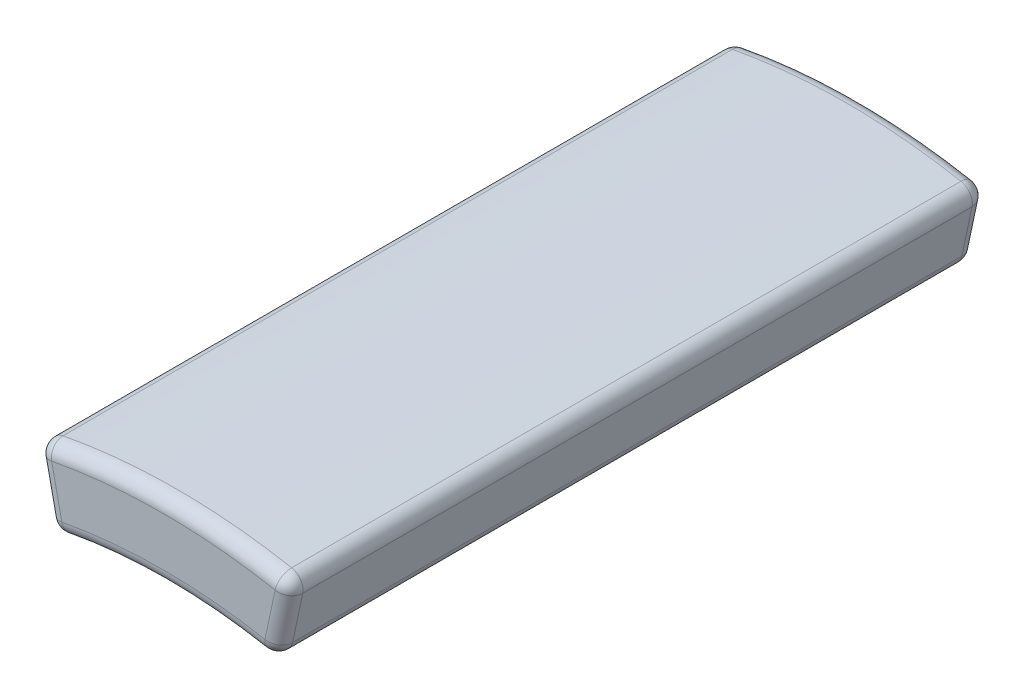
ISO-10303-21;
HEADER;
FILE_DESCRIPTION(('STEP AP214'),'2;1');
FILE_NAME('part.step','',(''),(''),'','','');
FILE_SCHEMA(('AUTOMOTIVE_DESIGN { 1 0 10303 214 1 1 1 1 }'));
ENDSEC;
DATA;
#1=APPLICATION_CONTEXT('core data for automotive mechanical design processes');
#2=APPLICATION_PROTOCOL_DEFINITION('international standard','automotive_design',2000,#1);
#3=PRODUCT_CONTEXT('',#1,'mechanical');
#4=PRODUCT('Part','Part','',(#3));
#5=PRODUCT_RELATED_PRODUCT_CATEGORY('part','',(#4));
#6=PRODUCT_DEFINITION_FORMATION('','',#4);
#7=PRODUCT_DEFINITION_CONTEXT('part definition',#1,'design');
#8=PRODUCT_DEFINITION('design','',#6,#7);
#9=PRODUCT_DEFINITION_SHAPE('','',#8);
#10=(LENGTH_UNIT() NAMED_UNIT(*) SI_UNIT(.MILLI.,.METRE.));
#11=(NAMED_UNIT(*) PLANE_ANGLE_UNIT() SI_UNIT($,.RADIAN.));
#12=(NAMED_UNIT(*) SI_UNIT($,.STERADIAN.) SOLID_ANGLE_UNIT());
#13=UNCERTAINTY_MEASURE_WITH_UNIT(LENGTH_MEASURE(1.E-05),#10,'distance_accuracy_value','');
#14=(GEOMETRIC_REPRESENTATION_CONTEXT(3) GLOBAL_UNCERTAINTY_ASSIGNED_CONTEXT((#13)) GLOBAL_UNIT_ASSIGNED_CONTEXT((#10,
#11,#12)) REPRESENTATION_CONTEXT('',''));
#15=CARTESIAN_POINT('',(0.,0.,0.));
#16=DIRECTION('',(0.,0.,1.));
#17=DIRECTION('',(1.,0.,0.));
#18=AXIS2_PLACEMENT_3D('',#15,#16,#17);
#19=CARTESIAN_POINT('',(0.,-16.6,10.));
#20=DIRECTION('',(0.,0.,-1.));
#21=DIRECTION('',(-1.,0.,0.));
#22=AXIS2_PLACEMENT_3D('',#19,#20,#21);
#23=CYLINDRICAL_SURFACE('',#22,15.5);
#24=DIRECTION('',(0.,0.,-1.));
#25=VECTOR('',#24,1.);
#26=CARTESIAN_POINT('',(2.84019522104078,-1.36243815085966,10.));
#27=LINE('',#26,#25);
#28=CARTESIAN_POINT('',(2.84019522104078,-1.36243815085966,-9.6));
#29=VERTEX_POINT('',#28);
#30=CARTESIAN_POINT('',(2.84019522104078,-1.36243815085966,9.6));
#31=VERTEX_POINT('',#30);
#32=EDGE_CURVE('E144',#29,#31,#27,.F.);
#33=ORIENTED_EDGE('',*,*,#32,.T.);
#34=CARTESIAN_POINT('',(0.,-16.6,9.6));
#35=DIRECTION('',(0.,0.,-1.));
#36=DIRECTION('',(-1.,0.,0.));
#37=AXIS2_PLACEMENT_3D('',#34,#35,#36);
#38=CIRCLE('',#37,15.5);
#39=CARTESIAN_POINT('',(-2.84019522104078,-1.36243815085966,9.6));
#40=VERTEX_POINT('',#39);
#41=EDGE_CURVE('E190',#31,#40,#38,.F.);
#42=ORIENTED_EDGE('',*,*,#41,.T.);
#43=DIRECTION('',(0.,0.,-1.));
#44=VECTOR('',#43,1.);
#45=CARTESIAN_POINT('',(-2.84019522104078,-1.36243815085966,10.));
#46=LINE('',#45,#44);
#47=CARTESIAN_POINT('',(-2.84019522104078,-1.36243815085966,-9.6));
#48=VERTEX_POINT('',#47);
#49=EDGE_CURVE('E185',#40,#48,#46,.T.);
#50=ORIENTED_EDGE('',*,*,#49,.T.);
#51=CARTESIAN_POINT('',(0.,-16.6,-9.6));
#52=DIRECTION('',(0.,0.,-1.));
#53=DIRECTION('',(-1.,0.,0.));
#54=AXIS2_PLACEMENT_3D('',#51,#52,#53);
#55=CIRCLE('',#54,15.5);
#56=EDGE_CURVE('E179',#48,#29,#55,.T.);
#57=ORIENTED_EDGE('',*,*,#56,.T.);
#58=EDGE_LOOP('',(#33,#42,#50,#57));
#59=FACE_BOUND('',#58,.T.);
#60=ADVANCED_FACE('F47',(#59),#23,.F.);
#61=CARTESIAN_POINT('',(3.22263120767522,-1.438712188626,10.));
#62=DIRECTION('',(-0.978147600733806,0.207911690817757,0.));
#63=DIRECTION('',(-0.207911690817757,-0.978147600733806,0.));
#64=AXIS2_PLACEMENT_3D('',#61,#62,#63);
#65=PLANE('',#64);
#66=DIRECTION('',(0.,0.,-1.));
#67=VECTOR('',#66,1.);
#68=CARTESIAN_POINT('',(3.59591068127171,0.317429662106353,10.));
#69=LINE('',#68,#67);
#70=CARTESIAN_POINT('',(3.59591068127171,0.317429662106353,-9.6));
#71=VERTEX_POINT('',#70);
#72=CARTESIAN_POINT('',(3.59591068127171,0.317429662106353,9.6));
#73=VERTEX_POINT('',#72);
#74=EDGE_CURVE('E169',#71,#73,#69,.F.);
#75=ORIENTED_EDGE('',*,*,#74,.T.);
#76=DIRECTION('',(0.207911690817757,0.978147600733806,0.));
#77=VECTOR('',#76,1.);
#78=CARTESIAN_POINT('',(3.22263120767522,-1.438712188626,9.6));
#79=LINE('',#78,#77);
#80=CARTESIAN_POINT('',(3.30474962187729,-1.0523754246283,9.6));
#81=VERTEX_POINT('',#80);
#82=EDGE_CURVE('E173',#73,#81,#79,.F.);
#83=ORIENTED_EDGE('',*,*,#82,.T.);
#84=DIRECTION('',(0.,0.,-1.));
#85=VECTOR('',#84,1.);
#86=CARTESIAN_POINT('',(3.30474962187729,-1.0523754246283,10.));
#87=LINE('',#86,#85);
#88=CARTESIAN_POINT('',(3.30474962187729,-1.0523754246283,-9.6));
#89=VERTEX_POINT('',#88);
#90=EDGE_CURVE('E142',#81,#89,#87,.T.);
#91=ORIENTED_EDGE('',*,*,#90,.T.);
#92=DIRECTION('',(0.207911690817757,0.978147600733806,0.));
#93=VECTOR('',#92,1.);
#94=CARTESIAN_POINT('',(3.68003692747428,0.713212532988371,-9.6));
#95=LINE('',#94,#93);
#96=EDGE_CURVE('E162',#89,#71,#95,.T.);
#97=ORIENTED_EDGE('',*,*,#96,.T.);
#98=EDGE_LOOP('',(#75,#83,#91,#97));
#99=FACE_BOUND('',#98,.T.);
#100=ADVANCED_FACE('F171',(#99),#65,.F.);
#101=CARTESIAN_POINT('',(0.,-16.6,10.));
#102=DIRECTION('',(0.,0.,-1.));
#103=DIRECTION('',(-1.,0.,0.));
#104=AXIS2_PLACEMENT_3D('',#101,#102,#103);
#105=CYLINDRICAL_SURFACE('',#104,17.7);
#106=DIRECTION('',(0.,0.,-1.));
#107=VECTOR('',#106,1.);
#108=CARTESIAN_POINT('',(-3.27874763267711,0.793671664177587,10.));
#109=LINE('',#108,#107);
#110=CARTESIAN_POINT('',(-3.27874763267711,0.793671664177586,-9.6));
#111=VERTEX_POINT('',#110);
#112=CARTESIAN_POINT('',(-3.27874763267711,0.793671664177586,9.6));
#113=VERTEX_POINT('',#112);
#114=EDGE_CURVE('E196',#111,#113,#109,.F.);
#115=ORIENTED_EDGE('',*,*,#114,.T.);
#116=CARTESIAN_POINT('',(0.,-16.6,9.6));
#117=DIRECTION('',(0.,0.,-1.));
#118=DIRECTION('',(-1.,0.,0.));
#119=AXIS2_PLACEMENT_3D('',#116,#117,#118);
#120=CIRCLE('',#119,17.7);
#121=CARTESIAN_POINT('',(3.27874763267711,0.793671664177585,9.6));
#122=VERTEX_POINT('',#121);
#123=EDGE_CURVE('E203',#113,#122,#120,.T.);
#124=ORIENTED_EDGE('',*,*,#123,.T.);
#125=DIRECTION('',(0.,0.,-1.));
#126=VECTOR('',#125,1.);
#127=CARTESIAN_POINT('',(3.27874763267711,0.793671664177587,10.));
#128=LINE('',#127,#126);
#129=CARTESIAN_POINT('',(3.27874763267711,0.793671664177585,-9.6));
#130=VERTEX_POINT('',#129);
#131=EDGE_CURVE('E199',#122,#130,#128,.T.);
#132=ORIENTED_EDGE('',*,*,#131,.T.);
#133=CARTESIAN_POINT('',(0.,-16.6,-9.6));
#134=DIRECTION('',(0.,0.,-1.));
#135=DIRECTION('',(-1.,0.,0.));
#136=AXIS2_PLACEMENT_3D('',#133,#134,#135);
#137=CIRCLE('',#136,17.7);
#138=EDGE_CURVE('E193',#130,#111,#137,.F.);
#139=ORIENTED_EDGE('',*,*,#138,.T.);
#140=EDGE_LOOP('',(#115,#124,#132,#139));
#141=FACE_BOUND('',#140,.T.);
#142=ADVANCED_FACE('F342',(#141),#105,.T.);
#143=CARTESIAN_POINT('',(-3.68003692747428,0.713212532988372,10.));
#144=DIRECTION('',(0.978147600733806,0.207911690817756,0.));
#145=DIRECTION('',(-0.207911690817756,0.978147600733806,0.));
#146=AXIS2_PLACEMENT_3D('',#143,#144,#145);
#147=PLANE('',#146);
#148=DIRECTION('',(0.,0.,-1.));
#149=VECTOR('',#148,1.);
#150=CARTESIAN_POINT('',(-3.30474962187729,-1.0523754246283,10.));
#151=LINE('',#150,#149);
#152=CARTESIAN_POINT('',(-3.30474962187729,-1.0523754246283,-9.6));
#153=VERTEX_POINT('',#152);
#154=CARTESIAN_POINT('',(-3.30474962187729,-1.0523754246283,9.6));
#155=VERTEX_POINT('',#154);
#156=EDGE_CURVE('E209',#153,#155,#151,.F.);
#157=ORIENTED_EDGE('',*,*,#156,.T.);
#158=DIRECTION('',(0.207911690817756,-0.978147600733806,0.));
#159=VECTOR('',#158,1.);
#160=CARTESIAN_POINT('',(-3.68003692747428,0.713212532988372,9.6));
#161=LINE('',#160,#159);
#162=CARTESIAN_POINT('',(-3.59591068127171,0.31742966210636,9.6));
#163=VERTEX_POINT('',#162);
#164=EDGE_CURVE('E216',#155,#163,#161,.F.);
#165=ORIENTED_EDGE('',*,*,#164,.T.);
#166=DIRECTION('',(0.,0.,-1.));
#167=VECTOR('',#166,1.);
#168=CARTESIAN_POINT('',(-3.59591068127171,0.31742966210636,10.));
#169=LINE('',#168,#167);
#170=CARTESIAN_POINT('',(-3.59591068127171,0.31742966210636,-9.6));
#171=VERTEX_POINT('',#170);
#172=EDGE_CURVE('E212',#163,#171,#169,.T.);
#173=ORIENTED_EDGE('',*,*,#172,.T.);
#174=DIRECTION('',(0.207911690817756,-0.978147600733806,0.));
#175=VECTOR('',#174,1.);
#176=CARTESIAN_POINT('',(-3.22263120767522,-1.438712188626,-9.6));
#177=LINE('',#176,#175);
#178=EDGE_CURVE('E206',#171,#153,#177,.T.);
#179=ORIENTED_EDGE('',*,*,#178,.T.);
#180=EDGE_LOOP('',(#157,#165,#173,#179));
#181=FACE_BOUND('',#180,.T.);
#182=ADVANCED_FACE('F353',(#181),#147,.F.);
#183=CARTESIAN_POINT('',(0.,-16.6,10.));
#184=DIRECTION('',(0.,0.,-1.));
#185=DIRECTION('',(-1.,0.,0.));
#186=AXIS2_PLACEMENT_3D('',#183,#184,#185);
#187=PLANE('',#186);
#188=CARTESIAN_POINT('',(0.,-16.6,10.));
#189=DIRECTION('',(0.,0.,-1.));
#190=DIRECTION('',(-1.,0.,0.));
#191=AXIS2_PLACEMENT_3D('',#188,#189,#190);
#192=CIRCLE('',#191,17.3);
#193=CARTESIAN_POINT('',(3.20465164097819,0.400594338433458,10.));
#194=VERTEX_POINT('',#193);
#195=CARTESIAN_POINT('',(-3.20465164097819,0.40059433843346,10.));
#196=VERTEX_POINT('',#195);
#197=EDGE_CURVE('E225',#194,#196,#192,.F.);
#198=ORIENTED_EDGE('',*,*,#197,.T.);
#199=DIRECTION('',(0.207911690817756,-0.978147600733806,0.));
#200=VECTOR('',#199,1.);
#201=CARTESIAN_POINT('',(0.391259040293527,-16.5168353236729,10.));
#202=LINE('',#201,#200);
#203=CARTESIAN_POINT('',(-2.91349058158377,-0.969210748301201,10.));
#204=VERTEX_POINT('',#203);
#205=EDGE_CURVE('E228',#196,#204,#202,.T.);
#206=ORIENTED_EDGE('',*,*,#205,.T.);
#207=CARTESIAN_POINT('',(0.,-16.6,10.));
#208=DIRECTION('',(0.,0.,-1.));
#209=DIRECTION('',(-1.,0.,0.));
#210=AXIS2_PLACEMENT_3D('',#207,#208,#209);
#211=CIRCLE('',#210,15.9);
#212=CARTESIAN_POINT('',(2.91349058158377,-0.9692107483012,10.));
#213=VERTEX_POINT('',#212);
#214=EDGE_CURVE('E219',#204,#213,#211,.T.);
#215=ORIENTED_EDGE('',*,*,#214,.T.);
#216=DIRECTION('',(0.207911690817757,0.978147600733806,0.));
#217=VECTOR('',#216,1.);
#218=CARTESIAN_POINT('',(-0.391259040293545,-16.5168353236729,10.));
#219=LINE('',#218,#217);
#220=EDGE_CURVE('E222',#213,#194,#219,.T.);
#221=ORIENTED_EDGE('',*,*,#220,.T.);
#222=EDGE_LOOP('',(#198,#206,#215,#221));
#223=FACE_BOUND('',#222,.T.);
#224=ADVANCED_FACE('F334',(#223),#187,.F.);
#225=CARTESIAN_POINT('',(0.,-16.6,-10.));
#226=DIRECTION('',(0.,0.,-1.));
#227=DIRECTION('',(-1.,0.,0.));
#228=AXIS2_PLACEMENT_3D('',#225,#226,#227);
#229=PLANE('',#228);
#230=CARTESIAN_POINT('',(0.,-16.6,-10.));
#231=DIRECTION('',(0.,0.,-1.));
#232=DIRECTION('',(-1.,0.,0.));
#233=AXIS2_PLACEMENT_3D('',#230,#231,#232);
#234=CIRCLE('',#233,17.3);
#235=CARTESIAN_POINT('',(-3.20465164097819,0.40059433843346,-10.));
#236=VERTEX_POINT('',#235);
#237=CARTESIAN_POINT('',(3.20465164097819,0.400594338433458,-10.));
#238=VERTEX_POINT('',#237);
#239=EDGE_CURVE('E57',#236,#238,#234,.T.);
#240=ORIENTED_EDGE('',*,*,#239,.T.);
#241=DIRECTION('',(0.207911690817757,0.978147600733806,0.));
#242=VECTOR('',#241,1.);
#243=CARTESIAN_POINT('',(2.83137216738169,-1.3555475122989,-10.));
#244=LINE('',#243,#242);
#245=CARTESIAN_POINT('',(2.91349058158377,-0.969210748301201,-10.));
#246=VERTEX_POINT('',#245);
#247=EDGE_CURVE('E11',#238,#246,#244,.F.);
#248=ORIENTED_EDGE('',*,*,#247,.T.);
#249=CARTESIAN_POINT('',(0.,-16.6,-10.));
#250=DIRECTION('',(0.,0.,-1.));
#251=DIRECTION('',(-1.,0.,0.));
#252=AXIS2_PLACEMENT_3D('',#249,#250,#251);
#253=CIRCLE('',#252,15.9);
#254=CARTESIAN_POINT('',(-2.91349058158377,-0.969210748301201,-10.));
#255=VERTEX_POINT('',#254);
#256=EDGE_CURVE('E232',#246,#255,#253,.F.);
#257=ORIENTED_EDGE('',*,*,#256,.T.);
#258=DIRECTION('',(0.207911690817756,-0.978147600733806,0.));
#259=VECTOR('',#258,1.);
#260=CARTESIAN_POINT('',(-3.28877788718076,0.796377209315475,-10.));
#261=LINE('',#260,#259);
#262=EDGE_CURVE('E68',#255,#236,#261,.F.);
#263=ORIENTED_EDGE('',*,*,#262,.T.);
#264=EDGE_LOOP('',(#240,#248,#257,#263));
#265=FACE_BOUND('',#264,.T.);
#266=ADVANCED_FACE('F479',(#265),#229,.T.);
#267=CARTESIAN_POINT('',(-3.20465164097819,0.400594338433462,10.));
#268=DIRECTION('',(0.,0.,-1.));
#269=DIRECTION('',(-1.,0.,0.));
#270=AXIS2_PLACEMENT_3D('',#267,#268,#269);
#271=CYLINDRICAL_SURFACE('',#270,0.4);
#272=CARTESIAN_POINT('',(-3.20465164097819,0.40059433843346,9.6));
#273=DIRECTION('',(0.,0.,1.));
#274=DIRECTION('',(1.,0.,0.));
#275=AXIS2_PLACEMENT_3D('',#272,#273,#274);
#276=CIRCLE('',#275,0.4);
#277=EDGE_CURVE('E51',#113,#163,#276,.T.);
#278=ORIENTED_EDGE('',*,*,#277,.F.);
#279=ORIENTED_EDGE('',*,*,#114,.F.);
#280=CARTESIAN_POINT('',(-3.20465164097819,0.400594338433462,-9.6));
#281=DIRECTION('',(0.,0.,-1.));
#282=DIRECTION('',(-1.,0.,0.));
#283=AXIS2_PLACEMENT_3D('',#280,#281,#282);
#284=CIRCLE('',#283,0.4);
#285=EDGE_CURVE('E309',#171,#111,#284,.T.);
#286=ORIENTED_EDGE('',*,*,#285,.F.);
#287=ORIENTED_EDGE('',*,*,#172,.F.);
#288=EDGE_LOOP('',(#278,#279,#286,#287));
#289=FACE_BOUND('',#288,.T.);
#290=ADVANCED_FACE('F49',(#289),#271,.T.);
#291=CARTESIAN_POINT('',(-3.20465164097819,0.400594338433461,9.6));
#292=DIRECTION('',(0.,0.,1.));
#293=DIRECTION('',(1.,0.,0.));
#294=AXIS2_PLACEMENT_3D('',#291,#292,#293);
#295=SPHERICAL_SURFACE('',#294,0.4);
#296=CARTESIAN_POINT('',(-3.20465164097819,0.40059433843346,9.6));
#297=DIRECTION('',(-0.982693314360315,-0.185239979247295,0.));
#298=DIRECTION('',(0.185239979247295,-0.982693314360315,0.));
#299=AXIS2_PLACEMENT_3D('',#296,#297,#298);
#300=CIRCLE('',#299,0.4);
#301=EDGE_CURVE('E302',#113,#196,#300,.F.);
#302=ORIENTED_EDGE('',*,*,#301,.F.);
#303=ORIENTED_EDGE('',*,*,#277,.T.);
#304=CARTESIAN_POINT('',(-3.20465164097819,0.400594338433462,9.6));
#305=DIRECTION('',(-0.207911690817756,0.978147600733806,0.));
#306=DIRECTION('',(-0.978147600733806,-0.207911690817756,0.));
#307=AXIS2_PLACEMENT_3D('',#304,#305,#306);
#308=CIRCLE('',#307,0.4);
#309=EDGE_CURVE('E306',#196,#163,#308,.F.);
#310=ORIENTED_EDGE('',*,*,#309,.F.);
#311=EDGE_LOOP('',(#302,#303,#310));
#312=FACE_BOUND('',#311,.T.);
#313=ADVANCED_FACE('F322',(#312),#295,.T.);
#314=CARTESIAN_POINT('',(-3.20465164097819,0.400594338433461,-9.6));
#315=DIRECTION('',(0.,0.,1.));
#316=DIRECTION('',(1.,0.,0.));
#317=AXIS2_PLACEMENT_3D('',#314,#315,#316);
#318=SPHERICAL_SURFACE('',#317,0.4);
#319=CARTESIAN_POINT('',(-3.20465164097819,0.40059433843346,-9.6));
#320=DIRECTION('',(-0.20791169081775,0.978147600733808,0.));
#321=DIRECTION('',(-0.978147600733808,-0.20791169081775,0.));
#322=AXIS2_PLACEMENT_3D('',#319,#320,#321);
#323=CIRCLE('',#322,0.4);
#324=EDGE_CURVE('E295',#171,#236,#323,.F.);
#325=ORIENTED_EDGE('',*,*,#324,.F.);
#326=ORIENTED_EDGE('',*,*,#285,.T.);
#327=CARTESIAN_POINT('',(-3.20465164097819,0.40059433843346,-9.6));
#328=DIRECTION('',(-0.982693314360316,-0.185239979247294,0.));
#329=DIRECTION('',(0.185239979247294,-0.982693314360316,0.));
#330=AXIS2_PLACEMENT_3D('',#327,#328,#329);
#331=CIRCLE('',#330,0.4);
#332=EDGE_CURVE('E298',#236,#111,#331,.F.);
#333=ORIENTED_EDGE('',*,*,#332,.F.);
#334=EDGE_LOOP('',(#325,#326,#333));
#335=FACE_BOUND('',#334,.T.);
#336=ADVANCED_FACE('F425',(#335),#318,.T.);
#337=CARTESIAN_POINT('',(0.391259040293526,-16.5168353236729,9.6));
#338=DIRECTION('',(0.207911690817756,-0.978147600733806,0.));
#339=DIRECTION('',(0.978147600733806,0.207911690817756,0.));
#340=AXIS2_PLACEMENT_3D('',#337,#338,#339);
#341=CYLINDRICAL_SURFACE('',#340,0.4);
#342=ORIENTED_EDGE('',*,*,#309,.T.);
#343=ORIENTED_EDGE('',*,*,#164,.F.);
#344=CARTESIAN_POINT('',(-2.91349058158377,-0.969210748301201,9.6));
#345=DIRECTION('',(0.207911690817746,-0.978147600733808,0.));
#346=DIRECTION('',(0.978147600733809,0.207911690817746,0.));
#347=AXIS2_PLACEMENT_3D('',#344,#345,#346);
#348=CIRCLE('',#347,0.4);
#349=EDGE_CURVE('E287',#204,#155,#348,.T.);
#350=ORIENTED_EDGE('',*,*,#349,.F.);
#351=ORIENTED_EDGE('',*,*,#205,.F.);
#352=EDGE_LOOP('',(#342,#343,#350,#351));
#353=FACE_BOUND('',#352,.T.);
#354=ADVANCED_FACE('F330',(#353),#341,.T.);
#355=CARTESIAN_POINT('',(0.,-16.6,9.6));
#356=DIRECTION('',(0.,0.,-1.));
#357=DIRECTION('',(-1.,0.,0.));
#358=AXIS2_PLACEMENT_3D('',#355,#356,#357);
#359=TOROIDAL_SURFACE('',#358,17.3,0.4);
#360=ORIENTED_EDGE('',*,*,#301,.T.);
#361=ORIENTED_EDGE('',*,*,#197,.F.);
#362=CARTESIAN_POINT('',(3.20465164097819,0.400594338433458,9.6));
#363=DIRECTION('',(0.982693314360315,-0.185239979247295,0.));
#364=DIRECTION('',(0.185239979247295,0.982693314360316,0.));
#365=AXIS2_PLACEMENT_3D('',#362,#363,#364);
#366=CIRCLE('',#365,0.4);
#367=EDGE_CURVE('E283',#122,#194,#366,.T.);
#368=ORIENTED_EDGE('',*,*,#367,.F.);
#369=ORIENTED_EDGE('',*,*,#123,.F.);
#370=EDGE_LOOP('',(#360,#361,#368,#369));
#371=FACE_BOUND('',#370,.T.);
#372=ADVANCED_FACE('F339',(#371),#359,.T.);
#373=CARTESIAN_POINT('',(3.20465164097819,0.400594338433455,10.));
#374=DIRECTION('',(0.,0.,-1.));
#375=DIRECTION('',(-1.,0.,0.));
#376=AXIS2_PLACEMENT_3D('',#373,#374,#375);
#377=CYLINDRICAL_SURFACE('',#376,0.4);
#378=CARTESIAN_POINT('',(3.20465164097819,0.400594338433458,-9.6));
#379=DIRECTION('',(0.,0.,-1.));
#380=DIRECTION('',(-1.,0.,0.));
#381=AXIS2_PLACEMENT_3D('',#378,#379,#380);
#382=CIRCLE('',#381,0.4);
#383=EDGE_CURVE('E275',#130,#71,#382,.T.);
#384=ORIENTED_EDGE('',*,*,#383,.F.);
#385=ORIENTED_EDGE('',*,*,#131,.F.);
#386=CARTESIAN_POINT('',(3.20465164097819,0.400594338433456,9.6));
#387=DIRECTION('',(0.,0.,1.));
#388=DIRECTION('',(1.,0.,0.));
#389=AXIS2_PLACEMENT_3D('',#386,#387,#388);
#390=CIRCLE('',#389,0.4);
#391=EDGE_CURVE('E279',#73,#122,#390,.T.);
#392=ORIENTED_EDGE('',*,*,#391,.F.);
#393=ORIENTED_EDGE('',*,*,#74,.F.);
#394=EDGE_LOOP('',(#384,#385,#392,#393));
#395=FACE_BOUND('',#394,.T.);
#396=ADVANCED_FACE('F346',(#395),#377,.T.);
#397=CARTESIAN_POINT('',(0.,-16.6,-9.6));
#398=DIRECTION('',(0.,0.,-1.));
#399=DIRECTION('',(-1.,0.,0.));
#400=AXIS2_PLACEMENT_3D('',#397,#398,#399);
#401=TOROIDAL_SURFACE('',#400,17.3,0.4);
#402=ORIENTED_EDGE('',*,*,#332,.T.);
#403=ORIENTED_EDGE('',*,*,#138,.F.);
#404=CARTESIAN_POINT('',(3.20465164097819,0.400594338433458,-9.6));
#405=DIRECTION('',(0.982693314360315,-0.185239979247295,0.));
#406=DIRECTION('',(0.185239979247295,0.982693314360316,0.));
#407=AXIS2_PLACEMENT_3D('',#404,#405,#406);
#408=CIRCLE('',#407,0.4);
#409=EDGE_CURVE('E272',#238,#130,#408,.T.);
#410=ORIENTED_EDGE('',*,*,#409,.F.);
#411=ORIENTED_EDGE('',*,*,#239,.F.);
#412=EDGE_LOOP('',(#402,#403,#410,#411));
#413=FACE_BOUND('',#412,.T.);
#414=ADVANCED_FACE('F351',(#413),#401,.T.);
#415=CARTESIAN_POINT('',(-3.28877788718076,0.796377209315475,-9.6));
#416=DIRECTION('',(-0.207911690817756,0.978147600733806,0.));
#417=DIRECTION('',(-0.978147600733806,-0.207911690817756,0.));
#418=AXIS2_PLACEMENT_3D('',#415,#416,#417);
#419=CYLINDRICAL_SURFACE('',#418,0.4);
#420=ORIENTED_EDGE('',*,*,#324,.T.);
#421=ORIENTED_EDGE('',*,*,#262,.F.);
#422=CARTESIAN_POINT('',(-2.91349058158377,-0.969210748301197,-9.6));
#423=DIRECTION('',(0.207911690817756,-0.978147600733806,0.));
#424=DIRECTION('',(0.978147600733806,0.207911690817756,0.));
#425=AXIS2_PLACEMENT_3D('',#422,#423,#424);
#426=CIRCLE('',#425,0.4);
#427=EDGE_CURVE('E268',#153,#255,#426,.T.);
#428=ORIENTED_EDGE('',*,*,#427,.F.);
#429=ORIENTED_EDGE('',*,*,#178,.F.);
#430=EDGE_LOOP('',(#420,#421,#428,#429));
#431=FACE_BOUND('',#430,.T.);
#432=ADVANCED_FACE('F362',(#431),#419,.T.);
#433=CARTESIAN_POINT('',(-2.91349058158377,-0.969210748301197,10.));
#434=DIRECTION('',(0.,0.,-1.));
#435=DIRECTION('',(-1.,0.,0.));
#436=AXIS2_PLACEMENT_3D('',#433,#434,#435);
#437=CYLINDRICAL_SURFACE('',#436,0.4);
#438=CARTESIAN_POINT('',(-2.91349058158377,-0.969210748301197,9.6));
#439=DIRECTION('',(0.,0.,1.));
#440=DIRECTION('',(1.,0.,0.));
#441=AXIS2_PLACEMENT_3D('',#438,#439,#440);
#442=CIRCLE('',#441,0.4);
#443=EDGE_CURVE('E291',#155,#40,#442,.T.);
#444=ORIENTED_EDGE('',*,*,#443,.F.);
#445=ORIENTED_EDGE('',*,*,#156,.F.);
#446=CARTESIAN_POINT('',(-2.91349058158377,-0.969210748301201,-9.6));
#447=DIRECTION('',(0.,0.,-1.));
#448=DIRECTION('',(-1.,0.,0.));
#449=AXIS2_PLACEMENT_3D('',#446,#447,#448);
#450=CIRCLE('',#449,0.4);
#451=EDGE_CURVE('E264',#48,#153,#450,.T.);
#452=ORIENTED_EDGE('',*,*,#451,.F.);
#453=ORIENTED_EDGE('',*,*,#49,.F.);
#454=EDGE_LOOP('',(#444,#445,#452,#453));
#455=FACE_BOUND('',#454,.T.);
#456=ADVANCED_FACE('F358',(#455),#437,.T.);
#457=CARTESIAN_POINT('',(-2.91349058158377,-0.9692107483012,9.6));
#458=DIRECTION('',(0.,0.,1.));
#459=DIRECTION('',(1.,0.,0.));
#460=AXIS2_PLACEMENT_3D('',#457,#458,#459);
#461=SPHERICAL_SURFACE('',#460,0.4);
#462=ORIENTED_EDGE('',*,*,#349,.T.);
#463=ORIENTED_EDGE('',*,*,#443,.T.);
#464=CARTESIAN_POINT('',(-2.91349058158377,-0.969210748301201,9.6));
#465=DIRECTION('',(-0.983068506396151,-0.18323840135747,0.));
#466=DIRECTION('',(0.18323840135747,-0.983068506396151,0.));
#467=AXIS2_PLACEMENT_3D('',#464,#465,#466);
#468=CIRCLE('',#467,0.4);
#469=EDGE_CURVE('E260',#204,#40,#468,.F.);
#470=ORIENTED_EDGE('',*,*,#469,.F.);
#471=EDGE_LOOP('',(#462,#463,#470));
#472=FACE_BOUND('',#471,.T.);
#473=ADVANCED_FACE('F372',(#472),#461,.T.);
#474=CARTESIAN_POINT('',(3.20465164097819,0.400594338433457,9.6));
#475=DIRECTION('',(0.,0.,1.));
#476=DIRECTION('',(1.,0.,0.));
#477=AXIS2_PLACEMENT_3D('',#474,#475,#476);
#478=SPHERICAL_SURFACE('',#477,0.4);
#479=ORIENTED_EDGE('',*,*,#391,.T.);
#480=ORIENTED_EDGE('',*,*,#367,.T.);
#481=CARTESIAN_POINT('',(3.20465164097819,0.400594338433458,9.6));
#482=DIRECTION('',(0.207911690817764,0.978147600733805,0.));
#483=DIRECTION('',(-0.978147600733805,0.207911690817764,0.));
#484=AXIS2_PLACEMENT_3D('',#481,#482,#483);
#485=CIRCLE('',#484,0.4);
#486=EDGE_CURVE('E256',#73,#194,#485,.F.);
#487=ORIENTED_EDGE('',*,*,#486,.F.);
#488=EDGE_LOOP('',(#479,#480,#487));
#489=FACE_BOUND('',#488,.T.);
#490=ADVANCED_FACE('F382',(#489),#478,.T.);
#491=CARTESIAN_POINT('',(3.20465164097819,0.400594338433457,-9.6));
#492=DIRECTION('',(0.,0.,1.));
#493=DIRECTION('',(1.,0.,0.));
#494=AXIS2_PLACEMENT_3D('',#491,#492,#493);
#495=SPHERICAL_SURFACE('',#494,0.4);
#496=ORIENTED_EDGE('',*,*,#409,.T.);
#497=ORIENTED_EDGE('',*,*,#383,.T.);
#498=CARTESIAN_POINT('',(3.20465164097819,0.400594338433456,-9.6));
#499=DIRECTION('',(0.207911690817757,0.978147600733806,0.));
#500=DIRECTION('',(-0.978147600733806,0.207911690817757,0.));
#501=AXIS2_PLACEMENT_3D('',#498,#499,#500);
#502=CIRCLE('',#501,0.4);
#503=EDGE_CURVE('E165',#238,#71,#502,.F.);
#504=ORIENTED_EDGE('',*,*,#503,.F.);
#505=EDGE_LOOP('',(#496,#497,#504));
#506=FACE_BOUND('',#505,.T.);
#507=ADVANCED_FACE('F384',(#506),#495,.T.);
#508=CARTESIAN_POINT('',(-2.91349058158377,-0.9692107483012,-9.6));
#509=DIRECTION('',(0.,0.,1.));
#510=DIRECTION('',(1.,0.,0.));
#511=AXIS2_PLACEMENT_3D('',#508,#509,#510);
#512=SPHERICAL_SURFACE('',#511,0.4);
#513=ORIENTED_EDGE('',*,*,#451,.T.);
#514=ORIENTED_EDGE('',*,*,#427,.T.);
#515=CARTESIAN_POINT('',(-2.91349058158377,-0.969210748301201,-9.6));
#516=DIRECTION('',(-0.983068506396151,-0.183238401357471,0.));
#517=DIRECTION('',(0.183238401357471,-0.983068506396151,0.));
#518=AXIS2_PLACEMENT_3D('',#515,#516,#517);
#519=CIRCLE('',#518,0.4);
#520=EDGE_CURVE('E250',#48,#255,#519,.F.);
#521=ORIENTED_EDGE('',*,*,#520,.F.);
#522=EDGE_LOOP('',(#513,#514,#521));
#523=FACE_BOUND('',#522,.T.);
#524=ADVANCED_FACE('F364',(#523),#512,.T.);
#525=CARTESIAN_POINT('',(0.,-16.6,9.6));
#526=DIRECTION('',(0.,0.,-1.));
#527=DIRECTION('',(-1.,0.,0.));
#528=AXIS2_PLACEMENT_3D('',#525,#526,#527);
#529=TOROIDAL_SURFACE('',#528,15.9,0.4);
#530=ORIENTED_EDGE('',*,*,#469,.T.);
#531=ORIENTED_EDGE('',*,*,#41,.F.);
#532=CARTESIAN_POINT('',(2.91349058158377,-0.9692107483012,9.6));
#533=DIRECTION('',(0.983068506396151,-0.183238401357469,0.));
#534=DIRECTION('',(0.183238401357469,0.983068506396151,0.));
#535=AXIS2_PLACEMENT_3D('',#532,#533,#534);
#536=CIRCLE('',#535,0.4);
#537=EDGE_CURVE('E246',#213,#31,#536,.T.);
#538=ORIENTED_EDGE('',*,*,#537,.F.);
#539=ORIENTED_EDGE('',*,*,#214,.F.);
#540=EDGE_LOOP('',(#530,#531,#538,#539));
#541=FACE_BOUND('',#540,.T.);
#542=ADVANCED_FACE('F374',(#541),#529,.T.);
#543=CARTESIAN_POINT('',(-0.391259040293545,-16.5168353236729,9.6));
#544=DIRECTION('',(0.207911690817757,0.978147600733806,0.));
#545=DIRECTION('',(-0.978147600733806,0.207911690817757,0.));
#546=AXIS2_PLACEMENT_3D('',#543,#544,#545);
#547=CYLINDRICAL_SURFACE('',#546,0.4);
#548=ORIENTED_EDGE('',*,*,#486,.T.);
#549=ORIENTED_EDGE('',*,*,#220,.F.);
#550=CARTESIAN_POINT('',(2.91349058158377,-0.9692107483012,9.6));
#551=DIRECTION('',(-0.207911690817757,-0.978147600733806,0.));
#552=DIRECTION('',(0.978147600733806,-0.207911690817757,0.));
#553=AXIS2_PLACEMENT_3D('',#550,#551,#552);
#554=CIRCLE('',#553,0.4);
#555=EDGE_CURVE('E159',#81,#213,#554,.T.);
#556=ORIENTED_EDGE('',*,*,#555,.F.);
#557=ORIENTED_EDGE('',*,*,#82,.F.);
#558=EDGE_LOOP('',(#548,#549,#556,#557));
#559=FACE_BOUND('',#558,.T.);
#560=ADVANCED_FACE('F380',(#559),#547,.T.);
#561=CARTESIAN_POINT('',(2.83137216738169,-1.3555475122989,-9.6));
#562=DIRECTION('',(-0.207911690817757,-0.978147600733806,0.));
#563=DIRECTION('',(0.978147600733806,-0.207911690817757,0.));
#564=AXIS2_PLACEMENT_3D('',#561,#562,#563);
#565=CYLINDRICAL_SURFACE('',#564,0.4);
#566=ORIENTED_EDGE('',*,*,#503,.T.);
#567=ORIENTED_EDGE('',*,*,#96,.F.);
#568=CARTESIAN_POINT('',(2.91349058158377,-0.969210748301204,-9.6));
#569=DIRECTION('',(-0.207911690817748,-0.978147600733808,0.));
#570=DIRECTION('',(0.978147600733808,-0.207911690817748,0.));
#571=AXIS2_PLACEMENT_3D('',#568,#569,#570);
#572=CIRCLE('',#571,0.4);
#573=EDGE_CURVE('E150',#246,#89,#572,.T.);
#574=ORIENTED_EDGE('',*,*,#573,.F.);
#575=ORIENTED_EDGE('',*,*,#247,.F.);
#576=EDGE_LOOP('',(#566,#567,#574,#575));
#577=FACE_BOUND('',#576,.T.);
#578=ADVANCED_FACE('F163',(#577),#565,.T.);
#579=CARTESIAN_POINT('',(0.,-16.6,-9.6));
#580=DIRECTION('',(0.,0.,-1.));
#581=DIRECTION('',(-1.,0.,0.));
#582=AXIS2_PLACEMENT_3D('',#579,#580,#581);
#583=TOROIDAL_SURFACE('',#582,15.9,0.4);
#584=ORIENTED_EDGE('',*,*,#520,.T.);
#585=ORIENTED_EDGE('',*,*,#256,.F.);
#586=CARTESIAN_POINT('',(2.91349058158377,-0.969210748301204,-9.6));
#587=DIRECTION('',(0.983068506396151,-0.18323840135747,0.));
#588=DIRECTION('',(0.18323840135747,0.983068506396151,0.));
#589=AXIS2_PLACEMENT_3D('',#586,#587,#588);
#590=CIRCLE('',#589,0.4);
#591=EDGE_CURVE('E154',#29,#246,#590,.T.);
#592=ORIENTED_EDGE('',*,*,#591,.F.);
#593=ORIENTED_EDGE('',*,*,#56,.F.);
#594=EDGE_LOOP('',(#584,#585,#592,#593));
#595=FACE_BOUND('',#594,.T.);
#596=ADVANCED_FACE('F367',(#595),#583,.T.);
#597=CARTESIAN_POINT('',(2.91349058158377,-0.969210748301202,9.6));
#598=DIRECTION('',(0.,0.,1.));
#599=DIRECTION('',(1.,0.,0.));
#600=AXIS2_PLACEMENT_3D('',#597,#598,#599);
#601=SPHERICAL_SURFACE('',#600,0.4);
#602=ORIENTED_EDGE('',*,*,#555,.T.);
#603=ORIENTED_EDGE('',*,*,#537,.T.);
#604=CARTESIAN_POINT('',(2.91349058158377,-0.969210748301204,9.6));
#605=DIRECTION('',(0.,0.,1.));
#606=DIRECTION('',(1.,0.,0.));
#607=AXIS2_PLACEMENT_3D('',#604,#605,#606);
#608=CIRCLE('',#607,0.4);
#609=EDGE_CURVE('E147',#81,#31,#608,.F.);
#610=ORIENTED_EDGE('',*,*,#609,.F.);
#611=EDGE_LOOP('',(#602,#603,#610));
#612=FACE_BOUND('',#611,.T.);
#613=ADVANCED_FACE('F378',(#612),#601,.T.);
#614=CARTESIAN_POINT('',(2.91349058158377,-0.9692107483012,-9.6));
#615=DIRECTION('',(0.,0.,1.));
#616=DIRECTION('',(1.,0.,0.));
#617=AXIS2_PLACEMENT_3D('',#614,#615,#616);
#618=SPHERICAL_SURFACE('',#617,0.4);
#619=ORIENTED_EDGE('',*,*,#591,.T.);
#620=ORIENTED_EDGE('',*,*,#573,.T.);
#621=CARTESIAN_POINT('',(2.91349058158377,-0.9692107483012,-9.6));
#622=DIRECTION('',(0.,0.,-1.));
#623=DIRECTION('',(-1.,0.,0.));
#624=AXIS2_PLACEMENT_3D('',#621,#622,#623);
#625=CIRCLE('',#624,0.4);
#626=EDGE_CURVE('E138',#29,#89,#625,.F.);
#627=ORIENTED_EDGE('',*,*,#626,.F.);
#628=EDGE_LOOP('',(#619,#620,#627));
#629=FACE_BOUND('',#628,.T.);
#630=ADVANCED_FACE('F152',(#629),#618,.T.);
#631=CARTESIAN_POINT('',(2.91349058158377,-0.9692107483012,10.));
#632=DIRECTION('',(0.,0.,-1.));
#633=DIRECTION('',(-1.,0.,0.));
#634=AXIS2_PLACEMENT_3D('',#631,#632,#633);
#635=CYLINDRICAL_SURFACE('',#634,0.4);
#636=ORIENTED_EDGE('',*,*,#609,.T.);
#637=ORIENTED_EDGE('',*,*,#32,.F.);
#638=ORIENTED_EDGE('',*,*,#626,.T.);
#639=ORIENTED_EDGE('',*,*,#90,.F.);
#640=EDGE_LOOP('',(#636,#637,#638,#639));
#641=FACE_BOUND('',#640,.T.);
#642=ADVANCED_FACE('F140',(#641),#635,.T.);
#643=CLOSED_SHELL('',(#60,#100,#142,#182,#224,#266,#290,#313,#336,#354,#372,#396,#414,#432,#456,
#473,#490,#507,#524,#542,#560,#578,#596,#613,#630,#642));
#644=MANIFOLD_SOLID_BREP('B2',#643);
#645=ADVANCED_BREP_SHAPE_REPRESENTATION('',(#18,#644),#14);
#646=SHAPE_DEFINITION_REPRESENTATION(#9,#645);
ENDSEC;
END-ISO-10303-21;
